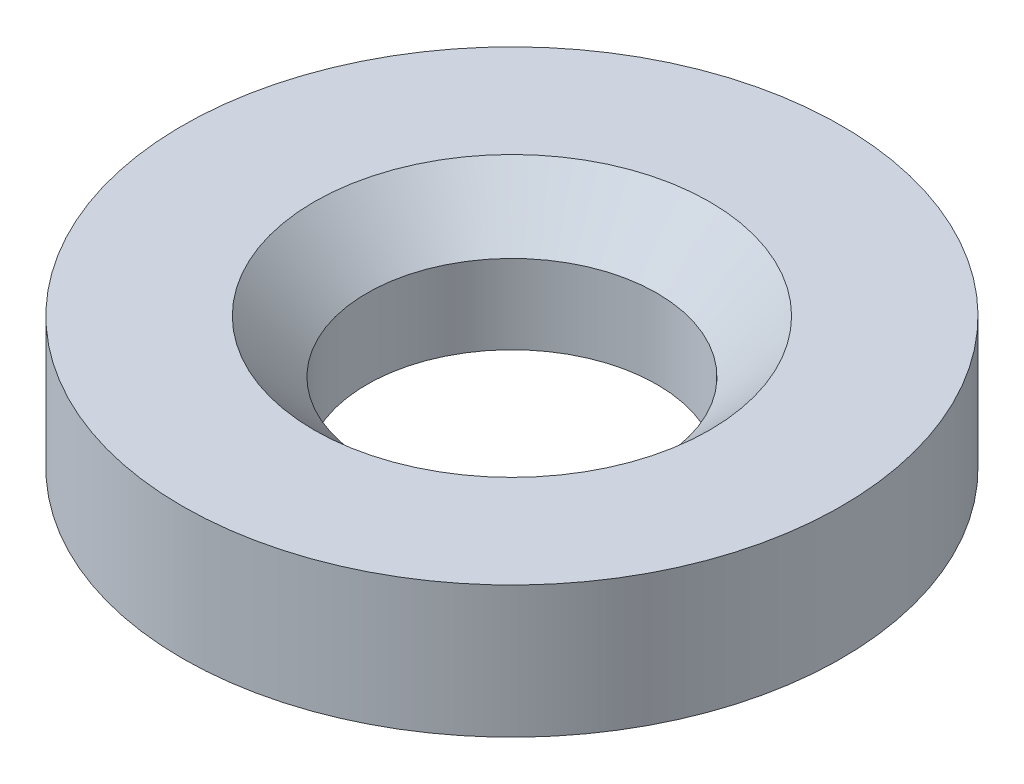
ISO-10303-21;
HEADER;
FILE_DESCRIPTION(('STEP AP214'),'2;1');
FILE_NAME('part.step','',(''),(''),'','','');
FILE_SCHEMA(('AUTOMOTIVE_DESIGN { 1 0 10303 214 1 1 1 1 }'));
ENDSEC;
DATA;
#1=APPLICATION_CONTEXT('core data for automotive mechanical design processes');
#2=APPLICATION_PROTOCOL_DEFINITION('international standard','automotive_design',2000,#1);
#3=PRODUCT_CONTEXT('',#1,'mechanical');
#4=PRODUCT('Part','Part','',(#3));
#5=PRODUCT_RELATED_PRODUCT_CATEGORY('part','',(#4));
#6=PRODUCT_DEFINITION_FORMATION('','',#4);
#7=PRODUCT_DEFINITION_CONTEXT('part definition',#1,'design');
#8=PRODUCT_DEFINITION('design','',#6,#7);
#9=PRODUCT_DEFINITION_SHAPE('','',#8);
#10=(LENGTH_UNIT() NAMED_UNIT(*) SI_UNIT(.MILLI.,.METRE.));
#11=(NAMED_UNIT(*) PLANE_ANGLE_UNIT() SI_UNIT($,.RADIAN.));
#12=(NAMED_UNIT(*) SI_UNIT($,.STERADIAN.) SOLID_ANGLE_UNIT());
#13=UNCERTAINTY_MEASURE_WITH_UNIT(LENGTH_MEASURE(1.E-05),#10,'distance_accuracy_value','');
#14=(GEOMETRIC_REPRESENTATION_CONTEXT(3) GLOBAL_UNCERTAINTY_ASSIGNED_CONTEXT((#13)) GLOBAL_UNIT_ASSIGNED_CONTEXT((#10,
#11,#12)) REPRESENTATION_CONTEXT('',''));
#15=CARTESIAN_POINT('',(0.,0.,0.));
#16=DIRECTION('',(0.,0.,1.));
#17=DIRECTION('',(1.,0.,0.));
#18=AXIS2_PLACEMENT_3D('',#15,#16,#17);
#19=CARTESIAN_POINT('',(0.,1.,0.));
#20=DIRECTION('',(0.,1.,0.));
#21=DIRECTION('',(0.,0.,1.));
#22=AXIS2_PLACEMENT_3D('',#19,#20,#21);
#23=PLANE('',#22);
#24=CARTESIAN_POINT('',(0.,1.,0.));
#25=DIRECTION('',(0.,1.,0.));
#26=DIRECTION('',(0.,0.,1.));
#27=AXIS2_PLACEMENT_3D('',#24,#25,#26);
#28=CIRCLE('',#27,2.5);
#29=CARTESIAN_POINT('',(0.,1.,2.5));
#30=VERTEX_POINT('',#29);
#31=EDGE_CURVE('E10',#30,#30,#28,.T.);
#32=ORIENTED_EDGE('',*,*,#31,.T.);
#33=EDGE_LOOP('',(#32));
#34=FACE_BOUND('',#33,.T.);
#35=CARTESIAN_POINT('',(0.,1.,0.));
#36=DIRECTION('',(0.,-1.,0.));
#37=DIRECTION('',(0.,0.,-1.));
#38=AXIS2_PLACEMENT_3D('',#35,#36,#37);
#39=CIRCLE('',#38,1.5);
#40=CARTESIAN_POINT('',(0.,1.,-1.5));
#41=VERTEX_POINT('',#40);
#42=EDGE_CURVE('E51',#41,#41,#39,.T.);
#43=ORIENTED_EDGE('',*,*,#42,.T.);
#44=EDGE_LOOP('',(#43));
#45=FACE_BOUND('',#44,.T.);
#46=ADVANCED_FACE('F33',(#34,#45),#23,.T.);
#47=CARTESIAN_POINT('',(0.,1.,0.));
#48=DIRECTION('',(0.,-1.,0.));
#49=DIRECTION('',(0.,0.,-1.));
#50=AXIS2_PLACEMENT_3D('',#47,#48,#49);
#51=CYLINDRICAL_SURFACE('',#50,1.1);
#52=CARTESIAN_POINT('',(0.,0.,0.));
#53=DIRECTION('',(0.,1.,0.));
#54=DIRECTION('',(0.,0.,1.));
#55=AXIS2_PLACEMENT_3D('',#52,#53,#54);
#56=CIRCLE('',#55,1.1);
#57=CARTESIAN_POINT('',(0.,0.,1.1));
#58=VERTEX_POINT('',#57);
#59=EDGE_CURVE('E44',#58,#58,#56,.T.);
#60=ORIENTED_EDGE('',*,*,#59,.F.);
#61=EDGE_LOOP('',(#60));
#62=FACE_BOUND('',#61,.T.);
#63=CARTESIAN_POINT('',(0.,0.600000000000002,0.));
#64=DIRECTION('',(0.,-1.,0.));
#65=DIRECTION('',(0.,0.,-1.));
#66=AXIS2_PLACEMENT_3D('',#63,#64,#65);
#67=CIRCLE('',#66,1.1);
#68=CARTESIAN_POINT('',(0.,0.600000000000002,-1.1));
#69=VERTEX_POINT('',#68);
#70=EDGE_CURVE('E48',#69,#69,#67,.T.);
#71=ORIENTED_EDGE('',*,*,#70,.F.);
#72=EDGE_LOOP('',(#71));
#73=FACE_BOUND('',#72,.T.);
#74=ADVANCED_FACE('F68',(#62,#73),#51,.F.);
#75=CARTESIAN_POINT('',(0.,0.,0.));
#76=DIRECTION('',(0.,1.,0.));
#77=DIRECTION('',(0.,0.,1.));
#78=AXIS2_PLACEMENT_3D('',#75,#76,#77);
#79=PLANE('',#78);
#80=CARTESIAN_POINT('',(0.,0.,0.));
#81=DIRECTION('',(0.,1.,0.));
#82=DIRECTION('',(0.,0.,1.));
#83=AXIS2_PLACEMENT_3D('',#80,#81,#82);
#84=CIRCLE('',#83,2.5);
#85=CARTESIAN_POINT('',(0.,0.,2.5));
#86=VERTEX_POINT('',#85);
#87=EDGE_CURVE('E37',#86,#86,#84,.T.);
#88=ORIENTED_EDGE('',*,*,#87,.F.);
#89=EDGE_LOOP('',(#88));
#90=FACE_BOUND('',#89,.T.);
#91=ORIENTED_EDGE('',*,*,#59,.T.);
#92=EDGE_LOOP('',(#91));
#93=FACE_BOUND('',#92,.T.);
#94=ADVANCED_FACE('F64',(#90,#93),#79,.F.);
#95=CARTESIAN_POINT('',(0.,1.,0.));
#96=DIRECTION('',(0.,-1.,0.));
#97=DIRECTION('',(0.,0.,-1.));
#98=AXIS2_PLACEMENT_3D('',#95,#96,#97);
#99=CYLINDRICAL_SURFACE('',#98,2.5);
#100=ORIENTED_EDGE('',*,*,#31,.F.);
#101=EDGE_LOOP('',(#100));
#102=FACE_BOUND('',#101,.T.);
#103=ORIENTED_EDGE('',*,*,#87,.T.);
#104=EDGE_LOOP('',(#103));
#105=FACE_BOUND('',#104,.T.);
#106=ADVANCED_FACE('F35',(#102,#105),#99,.T.);
#107=CARTESIAN_POINT('',(0.,1.,0.));
#108=DIRECTION('',(0.,1.,0.));
#109=DIRECTION('',(0.,0.,1.));
#110=AXIS2_PLACEMENT_3D('',#107,#108,#109);
#111=CONICAL_SURFACE('',#110,1.5,0.785398163397451);
#112=ORIENTED_EDGE('',*,*,#70,.T.);
#113=EDGE_LOOP('',(#112));
#114=FACE_BOUND('',#113,.T.);
#115=ORIENTED_EDGE('',*,*,#42,.F.);
#116=EDGE_LOOP('',(#115));
#117=FACE_BOUND('',#116,.T.);
#118=ADVANCED_FACE('F56',(#114,#117),#111,.F.);
#119=CLOSED_SHELL('',(#46,#74,#94,#106,#118));
#120=MANIFOLD_SOLID_BREP('B2',#119);
#121=ADVANCED_BREP_SHAPE_REPRESENTATION('',(#18,#120),#14);
#122=SHAPE_DEFINITION_REPRESENTATION(#9,#121);
ENDSEC;
END-ISO-10303-21;
